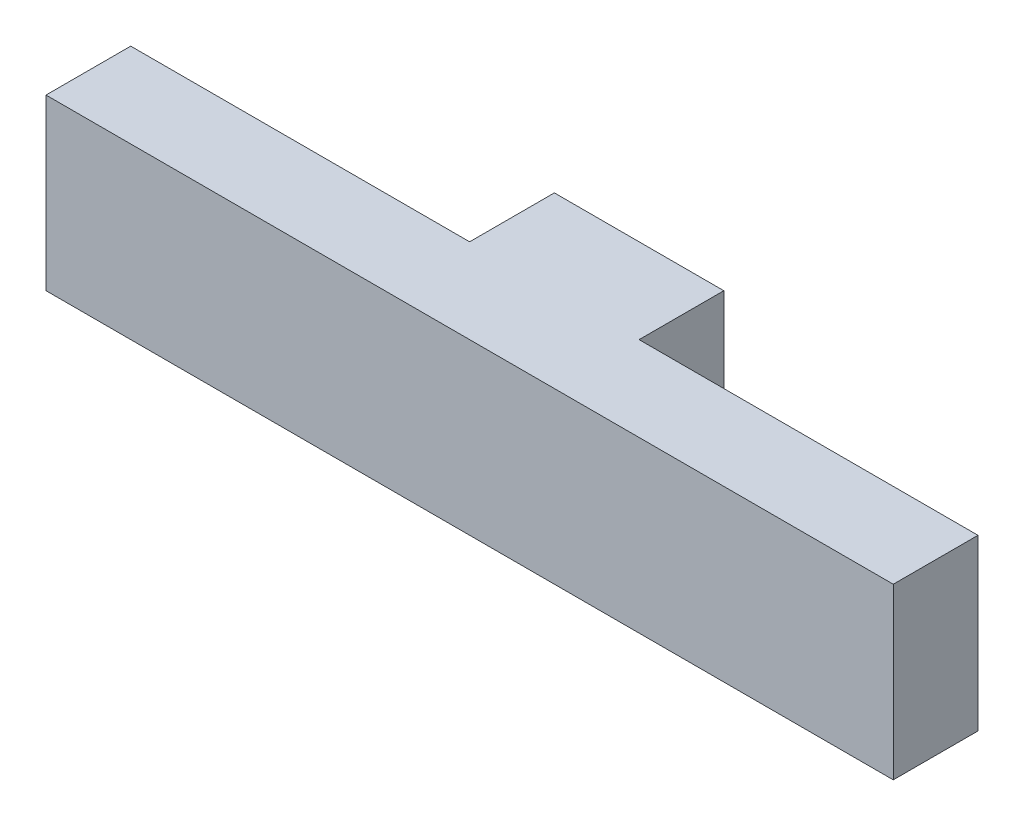
ISO-10303-21;
HEADER;
FILE_DESCRIPTION(('STEP AP214'),'2;1');
FILE_NAME('part.step','',(''),(''),'','','');
FILE_SCHEMA(('AUTOMOTIVE_DESIGN { 1 0 10303 214 1 1 1 1 }'));
ENDSEC;
DATA;
#1=APPLICATION_CONTEXT('core data for automotive mechanical design processes');
#2=APPLICATION_PROTOCOL_DEFINITION('international standard','automotive_design',2000,#1);
#3=PRODUCT_CONTEXT('',#1,'mechanical');
#4=PRODUCT('Part','Part','',(#3));
#5=PRODUCT_RELATED_PRODUCT_CATEGORY('part','',(#4));
#6=PRODUCT_DEFINITION_FORMATION('','',#4);
#7=PRODUCT_DEFINITION_CONTEXT('part definition',#1,'design');
#8=PRODUCT_DEFINITION('design','',#6,#7);
#9=PRODUCT_DEFINITION_SHAPE('','',#8);
#10=(LENGTH_UNIT() NAMED_UNIT(*) SI_UNIT(.MILLI.,.METRE.));
#11=(NAMED_UNIT(*) PLANE_ANGLE_UNIT() SI_UNIT($,.RADIAN.));
#12=(NAMED_UNIT(*) SI_UNIT($,.STERADIAN.) SOLID_ANGLE_UNIT());
#13=UNCERTAINTY_MEASURE_WITH_UNIT(LENGTH_MEASURE(1.E-05),#10,'distance_accuracy_value','');
#14=(GEOMETRIC_REPRESENTATION_CONTEXT(3) GLOBAL_UNCERTAINTY_ASSIGNED_CONTEXT((#13)) GLOBAL_UNIT_ASSIGNED_CONTEXT((#10,
#11,#12)) REPRESENTATION_CONTEXT('',''));
#15=CARTESIAN_POINT('',(0.,0.,0.));
#16=DIRECTION('',(0.,0.,1.));
#17=DIRECTION('',(1.,0.,0.));
#18=AXIS2_PLACEMENT_3D('',#15,#16,#17);
#19=CARTESIAN_POINT('',(50.,20.,20.));
#20=DIRECTION('',(-1.,0.,0.));
#21=DIRECTION('',(0.,0.,1.));
#22=AXIS2_PLACEMENT_3D('',#19,#20,#21);
#23=PLANE('',#22);
#24=DIRECTION('',(0.,0.,-1.));
#25=VECTOR('',#24,1.);
#26=CARTESIAN_POINT('',(50.,0.,20.));
#27=LINE('',#26,#25);
#28=CARTESIAN_POINT('',(50.,0.,20.));
#29=VERTEX_POINT('',#28);
#30=CARTESIAN_POINT('',(50.,0.,10.));
#31=VERTEX_POINT('',#30);
#32=EDGE_CURVE('E140',#29,#31,#27,.T.);
#33=ORIENTED_EDGE('',*,*,#32,.T.);
#34=DIRECTION('',(0.,-1.,0.));
#35=VECTOR('',#34,1.);
#36=CARTESIAN_POINT('',(50.,20.,10.));
#37=LINE('',#36,#35);
#38=CARTESIAN_POINT('',(50.,20.,10.));
#39=VERTEX_POINT('',#38);
#40=EDGE_CURVE('E11',#39,#31,#37,.T.);
#41=ORIENTED_EDGE('',*,*,#40,.F.);
#42=DIRECTION('',(0.,0.,-1.));
#43=VECTOR('',#42,1.);
#44=CARTESIAN_POINT('',(50.,20.,20.));
#45=LINE('',#44,#43);
#46=CARTESIAN_POINT('',(50.,20.,20.));
#47=VERTEX_POINT('',#46);
#48=EDGE_CURVE('E162',#47,#39,#45,.T.);
#49=ORIENTED_EDGE('',*,*,#48,.F.);
#50=DIRECTION('',(0.,-1.,0.));
#51=VECTOR('',#50,1.);
#52=CARTESIAN_POINT('',(50.,20.,20.));
#53=LINE('',#52,#51);
#54=EDGE_CURVE('E136',#47,#29,#53,.T.);
#55=ORIENTED_EDGE('',*,*,#54,.T.);
#56=EDGE_LOOP('',(#33,#41,#49,#55));
#57=FACE_BOUND('',#56,.T.);
#58=ADVANCED_FACE('F39',(#57),#23,.F.);
#59=CARTESIAN_POINT('',(50.,20.,10.));
#60=DIRECTION('',(0.,0.,1.));
#61=DIRECTION('',(1.,0.,0.));
#62=AXIS2_PLACEMENT_3D('',#59,#60,#61);
#63=PLANE('',#62);
#64=DIRECTION('',(-1.,0.,0.));
#65=VECTOR('',#64,1.);
#66=CARTESIAN_POINT('',(50.,0.,10.));
#67=LINE('',#66,#65);
#68=CARTESIAN_POINT('',(10.,0.,10.));
#69=VERTEX_POINT('',#68);
#70=EDGE_CURVE('E144',#31,#69,#67,.T.);
#71=ORIENTED_EDGE('',*,*,#70,.T.);
#72=DIRECTION('',(0.,-1.,0.));
#73=VECTOR('',#72,1.);
#74=CARTESIAN_POINT('',(10.,20.,10.));
#75=LINE('',#74,#73);
#76=CARTESIAN_POINT('',(10.,20.,10.));
#77=VERTEX_POINT('',#76);
#78=EDGE_CURVE('E48',#77,#69,#75,.T.);
#79=ORIENTED_EDGE('',*,*,#78,.F.);
#80=DIRECTION('',(-1.,0.,0.));
#81=VECTOR('',#80,1.);
#82=CARTESIAN_POINT('',(50.,20.,10.));
#83=LINE('',#82,#81);
#84=EDGE_CURVE('E99',#39,#77,#83,.T.);
#85=ORIENTED_EDGE('',*,*,#84,.F.);
#86=ORIENTED_EDGE('',*,*,#40,.T.);
#87=EDGE_LOOP('',(#71,#79,#85,#86));
#88=FACE_BOUND('',#87,.T.);
#89=ADVANCED_FACE('F208',(#88),#63,.F.);
#90=CARTESIAN_POINT('',(10.,20.,10.));
#91=DIRECTION('',(-1.,0.,0.));
#92=DIRECTION('',(0.,0.,1.));
#93=AXIS2_PLACEMENT_3D('',#90,#91,#92);
#94=PLANE('',#93);
#95=DIRECTION('',(0.,0.,-1.));
#96=VECTOR('',#95,1.);
#97=CARTESIAN_POINT('',(10.,0.,10.));
#98=LINE('',#97,#96);
#99=CARTESIAN_POINT('',(10.,0.,0.));
#100=VERTEX_POINT('',#99);
#101=EDGE_CURVE('E147',#69,#100,#98,.T.);
#102=ORIENTED_EDGE('',*,*,#101,.T.);
#103=DIRECTION('',(0.,-1.,0.));
#104=VECTOR('',#103,1.);
#105=CARTESIAN_POINT('',(10.,20.,0.));
#106=LINE('',#105,#104);
#107=CARTESIAN_POINT('',(10.,20.,0.));
#108=VERTEX_POINT('',#107);
#109=EDGE_CURVE('E173',#108,#100,#106,.T.);
#110=ORIENTED_EDGE('',*,*,#109,.F.);
#111=DIRECTION('',(0.,0.,-1.));
#112=VECTOR('',#111,1.);
#113=CARTESIAN_POINT('',(10.,20.,10.));
#114=LINE('',#113,#112);
#115=EDGE_CURVE('E183',#77,#108,#114,.T.);
#116=ORIENTED_EDGE('',*,*,#115,.F.);
#117=ORIENTED_EDGE('',*,*,#78,.T.);
#118=EDGE_LOOP('',(#102,#110,#116,#117));
#119=FACE_BOUND('',#118,.T.);
#120=ADVANCED_FACE('F181',(#119),#94,.F.);
#121=CARTESIAN_POINT('',(-10.,20.,0.));
#122=DIRECTION('',(0.,0.,1.));
#123=DIRECTION('',(1.,0.,0.));
#124=AXIS2_PLACEMENT_3D('',#121,#122,#123);
#125=PLANE('',#124);
#126=DIRECTION('',(-1.,0.,0.));
#127=VECTOR('',#126,1.);
#128=CARTESIAN_POINT('',(-10.,0.,0.));
#129=LINE('',#128,#127);
#130=CARTESIAN_POINT('',(-10.,0.,0.));
#131=VERTEX_POINT('',#130);
#132=EDGE_CURVE('E150',#100,#131,#129,.T.);
#133=ORIENTED_EDGE('',*,*,#132,.T.);
#134=DIRECTION('',(0.,-1.,0.));
#135=VECTOR('',#134,1.);
#136=CARTESIAN_POINT('',(-10.,20.,0.));
#137=LINE('',#136,#135);
#138=CARTESIAN_POINT('',(-10.,20.,0.));
#139=VERTEX_POINT('',#138);
#140=EDGE_CURVE('E169',#139,#131,#137,.T.);
#141=ORIENTED_EDGE('',*,*,#140,.F.);
#142=DIRECTION('',(-1.,0.,0.));
#143=VECTOR('',#142,1.);
#144=CARTESIAN_POINT('',(-10.,20.,0.));
#145=LINE('',#144,#143);
#146=EDGE_CURVE('E196',#108,#139,#145,.T.);
#147=ORIENTED_EDGE('',*,*,#146,.F.);
#148=ORIENTED_EDGE('',*,*,#109,.T.);
#149=EDGE_LOOP('',(#133,#141,#147,#148));
#150=FACE_BOUND('',#149,.T.);
#151=ADVANCED_FACE('F191',(#150),#125,.F.);
#152=CARTESIAN_POINT('',(-10.,20.,10.));
#153=DIRECTION('',(1.,0.,0.));
#154=DIRECTION('',(0.,0.,-1.));
#155=AXIS2_PLACEMENT_3D('',#152,#153,#154);
#156=PLANE('',#155);
#157=DIRECTION('',(0.,0.,1.));
#158=VECTOR('',#157,1.);
#159=CARTESIAN_POINT('',(-10.,0.,10.));
#160=LINE('',#159,#158);
#161=CARTESIAN_POINT('',(-10.,0.,10.));
#162=VERTEX_POINT('',#161);
#163=EDGE_CURVE('E153',#131,#162,#160,.T.);
#164=ORIENTED_EDGE('',*,*,#163,.T.);
#165=DIRECTION('',(0.,-1.,0.));
#166=VECTOR('',#165,1.);
#167=CARTESIAN_POINT('',(-10.,20.,10.));
#168=LINE('',#167,#166);
#169=CARTESIAN_POINT('',(-10.,20.,10.));
#170=VERTEX_POINT('',#169);
#171=EDGE_CURVE('E129',#170,#162,#168,.T.);
#172=ORIENTED_EDGE('',*,*,#171,.F.);
#173=DIRECTION('',(0.,0.,1.));
#174=VECTOR('',#173,1.);
#175=CARTESIAN_POINT('',(-10.,20.,10.));
#176=LINE('',#175,#174);
#177=EDGE_CURVE('E118',#139,#170,#176,.T.);
#178=ORIENTED_EDGE('',*,*,#177,.F.);
#179=ORIENTED_EDGE('',*,*,#140,.T.);
#180=EDGE_LOOP('',(#164,#172,#178,#179));
#181=FACE_BOUND('',#180,.T.);
#182=ADVANCED_FACE('F194',(#181),#156,.F.);
#183=CARTESIAN_POINT('',(-50.,20.,10.));
#184=DIRECTION('',(0.,0.,1.));
#185=DIRECTION('',(1.,0.,0.));
#186=AXIS2_PLACEMENT_3D('',#183,#184,#185);
#187=PLANE('',#186);
#188=DIRECTION('',(-1.,0.,0.));
#189=VECTOR('',#188,1.);
#190=CARTESIAN_POINT('',(-50.,0.,10.));
#191=LINE('',#190,#189);
#192=CARTESIAN_POINT('',(-50.,0.,10.));
#193=VERTEX_POINT('',#192);
#194=EDGE_CURVE('E127',#162,#193,#191,.T.);
#195=ORIENTED_EDGE('',*,*,#194,.T.);
#196=DIRECTION('',(0.,-1.,0.));
#197=VECTOR('',#196,1.);
#198=CARTESIAN_POINT('',(-50.,20.,10.));
#199=LINE('',#198,#197);
#200=CARTESIAN_POINT('',(-50.,20.,10.));
#201=VERTEX_POINT('',#200);
#202=EDGE_CURVE('E124',#201,#193,#199,.T.);
#203=ORIENTED_EDGE('',*,*,#202,.F.);
#204=DIRECTION('',(-1.,0.,0.));
#205=VECTOR('',#204,1.);
#206=CARTESIAN_POINT('',(-50.,20.,10.));
#207=LINE('',#206,#205);
#208=EDGE_CURVE('E112',#170,#201,#207,.T.);
#209=ORIENTED_EDGE('',*,*,#208,.F.);
#210=ORIENTED_EDGE('',*,*,#171,.T.);
#211=EDGE_LOOP('',(#195,#203,#209,#210));
#212=FACE_BOUND('',#211,.T.);
#213=ADVANCED_FACE('F125',(#212),#187,.F.);
#214=CARTESIAN_POINT('',(-50.,20.,20.));
#215=DIRECTION('',(1.,0.,0.));
#216=DIRECTION('',(0.,0.,-1.));
#217=AXIS2_PLACEMENT_3D('',#214,#215,#216);
#218=PLANE('',#217);
#219=DIRECTION('',(0.,0.,1.));
#220=VECTOR('',#219,1.);
#221=CARTESIAN_POINT('',(-50.,0.,20.));
#222=LINE('',#221,#220);
#223=CARTESIAN_POINT('',(-50.,0.,20.));
#224=VERTEX_POINT('',#223);
#225=EDGE_CURVE('E85',#193,#224,#222,.T.);
#226=ORIENTED_EDGE('',*,*,#225,.T.);
#227=DIRECTION('',(0.,-1.,0.));
#228=VECTOR('',#227,1.);
#229=CARTESIAN_POINT('',(-50.,20.,20.));
#230=LINE('',#229,#228);
#231=CARTESIAN_POINT('',(-50.,20.,20.));
#232=VERTEX_POINT('',#231);
#233=EDGE_CURVE('E130',#232,#224,#230,.T.);
#234=ORIENTED_EDGE('',*,*,#233,.F.);
#235=DIRECTION('',(0.,0.,1.));
#236=VECTOR('',#235,1.);
#237=CARTESIAN_POINT('',(-50.,20.,20.));
#238=LINE('',#237,#236);
#239=EDGE_CURVE('E116',#201,#232,#238,.T.);
#240=ORIENTED_EDGE('',*,*,#239,.F.);
#241=ORIENTED_EDGE('',*,*,#202,.T.);
#242=EDGE_LOOP('',(#226,#234,#240,#241));
#243=FACE_BOUND('',#242,.T.);
#244=ADVANCED_FACE('F132',(#243),#218,.F.);
#245=CARTESIAN_POINT('',(50.,20.,20.));
#246=DIRECTION('',(0.,0.,-1.));
#247=DIRECTION('',(-1.,0.,0.));
#248=AXIS2_PLACEMENT_3D('',#245,#246,#247);
#249=PLANE('',#248);
#250=DIRECTION('',(1.,0.,0.));
#251=VECTOR('',#250,1.);
#252=CARTESIAN_POINT('',(50.,0.,20.));
#253=LINE('',#252,#251);
#254=EDGE_CURVE('E91',#224,#29,#253,.T.);
#255=ORIENTED_EDGE('',*,*,#254,.T.);
#256=ORIENTED_EDGE('',*,*,#54,.F.);
#257=DIRECTION('',(1.,0.,0.));
#258=VECTOR('',#257,1.);
#259=CARTESIAN_POINT('',(50.,20.,20.));
#260=LINE('',#259,#258);
#261=EDGE_CURVE('E56',#232,#47,#260,.T.);
#262=ORIENTED_EDGE('',*,*,#261,.F.);
#263=ORIENTED_EDGE('',*,*,#233,.T.);
#264=EDGE_LOOP('',(#255,#256,#262,#263));
#265=FACE_BOUND('',#264,.T.);
#266=ADVANCED_FACE('F224',(#265),#249,.F.);
#267=CARTESIAN_POINT('',(0.,20.,0.));
#268=DIRECTION('',(0.,1.,0.));
#269=DIRECTION('',(0.,0.,1.));
#270=AXIS2_PLACEMENT_3D('',#267,#268,#269);
#271=PLANE('',#270);
#272=ORIENTED_EDGE('',*,*,#48,.T.);
#273=ORIENTED_EDGE('',*,*,#84,.T.);
#274=ORIENTED_EDGE('',*,*,#115,.T.);
#275=ORIENTED_EDGE('',*,*,#146,.T.);
#276=ORIENTED_EDGE('',*,*,#177,.T.);
#277=ORIENTED_EDGE('',*,*,#208,.T.);
#278=ORIENTED_EDGE('',*,*,#239,.T.);
#279=ORIENTED_EDGE('',*,*,#261,.T.);
#280=EDGE_LOOP('',(#272,#273,#274,#275,#276,#277,#278,#279));
#281=FACE_BOUND('',#280,.T.);
#282=ADVANCED_FACE('F114',(#281),#271,.T.);
#283=CARTESIAN_POINT('',(0.,0.,0.));
#284=DIRECTION('',(0.,1.,0.));
#285=DIRECTION('',(0.,0.,1.));
#286=AXIS2_PLACEMENT_3D('',#283,#284,#285);
#287=PLANE('',#286);
#288=ORIENTED_EDGE('',*,*,#32,.F.);
#289=ORIENTED_EDGE('',*,*,#254,.F.);
#290=ORIENTED_EDGE('',*,*,#225,.F.);
#291=ORIENTED_EDGE('',*,*,#194,.F.);
#292=ORIENTED_EDGE('',*,*,#163,.F.);
#293=ORIENTED_EDGE('',*,*,#132,.F.);
#294=ORIENTED_EDGE('',*,*,#101,.F.);
#295=ORIENTED_EDGE('',*,*,#70,.F.);
#296=EDGE_LOOP('',(#288,#289,#290,#291,#292,#293,#294,#295));
#297=FACE_BOUND('',#296,.T.);
#298=ADVANCED_FACE('F187',(#297),#287,.F.);
#299=CLOSED_SHELL('',(#58,#89,#120,#151,#182,#213,#244,#266,#282,#298));
#300=MANIFOLD_SOLID_BREP('B2',#299);
#301=ADVANCED_BREP_SHAPE_REPRESENTATION('',(#18,#300),#14);
#302=SHAPE_DEFINITION_REPRESENTATION(#9,#301);
ENDSEC;
END-ISO-10303-21;
